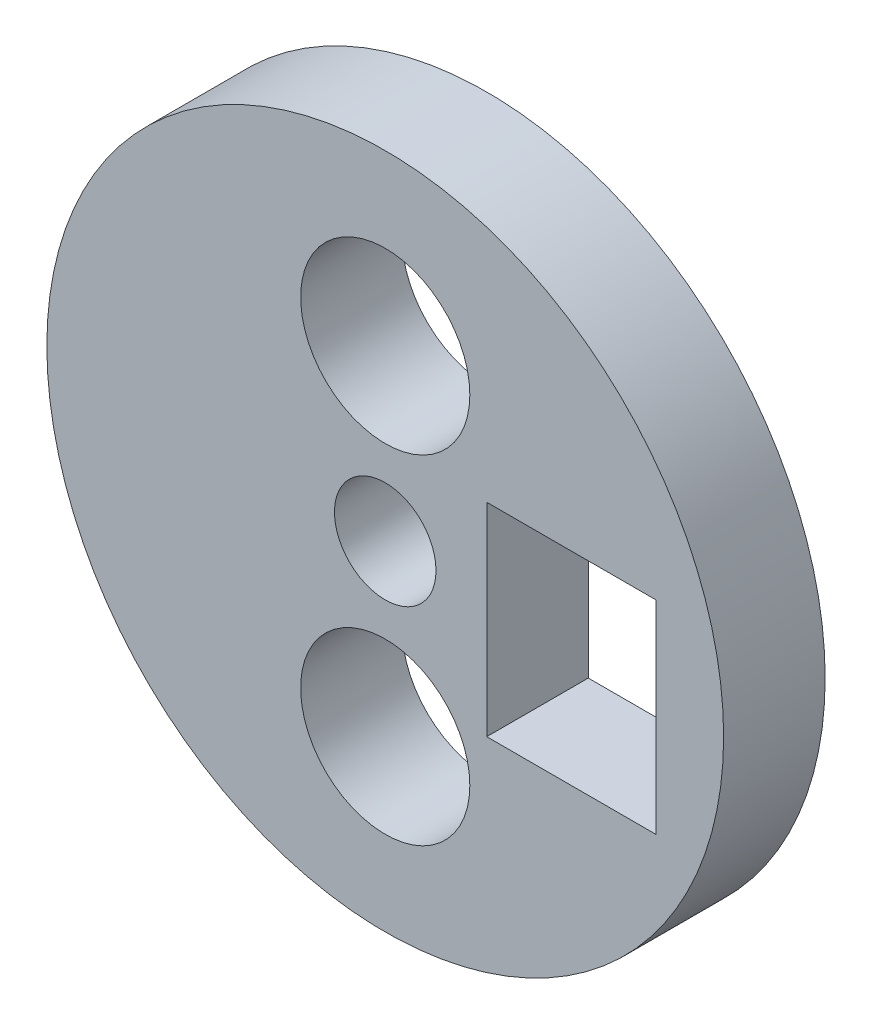
ISO-10303-21;
HEADER;
FILE_DESCRIPTION(('STEP AP214'),'2;1');
FILE_NAME('part.step','',(''),(''),'','','');
FILE_SCHEMA(('AUTOMOTIVE_DESIGN { 1 0 10303 214 1 1 1 1 }'));
ENDSEC;
DATA;
#1=APPLICATION_CONTEXT('core data for automotive mechanical design processes');
#2=APPLICATION_PROTOCOL_DEFINITION('international standard','automotive_design',2000,#1);
#3=PRODUCT_CONTEXT('',#1,'mechanical');
#4=PRODUCT('Part','Part','',(#3));
#5=PRODUCT_RELATED_PRODUCT_CATEGORY('part','',(#4));
#6=PRODUCT_DEFINITION_FORMATION('','',#4);
#7=PRODUCT_DEFINITION_CONTEXT('part definition',#1,'design');
#8=PRODUCT_DEFINITION('design','',#6,#7);
#9=PRODUCT_DEFINITION_SHAPE('','',#8);
#10=(LENGTH_UNIT() NAMED_UNIT(*) SI_UNIT(.MILLI.,.METRE.));
#11=(NAMED_UNIT(*) PLANE_ANGLE_UNIT() SI_UNIT($,.RADIAN.));
#12=(NAMED_UNIT(*) SI_UNIT($,.STERADIAN.) SOLID_ANGLE_UNIT());
#13=UNCERTAINTY_MEASURE_WITH_UNIT(LENGTH_MEASURE(1.E-05),#10,'distance_accuracy_value','');
#14=(GEOMETRIC_REPRESENTATION_CONTEXT(3) GLOBAL_UNCERTAINTY_ASSIGNED_CONTEXT((#13)) GLOBAL_UNIT_ASSIGNED_CONTEXT((#10,
#11,#12)) REPRESENTATION_CONTEXT('',''));
#15=CARTESIAN_POINT('',(0.,0.,0.));
#16=DIRECTION('',(0.,0.,1.));
#17=DIRECTION('',(1.,0.,0.));
#18=AXIS2_PLACEMENT_3D('',#15,#16,#17);
#19=CARTESIAN_POINT('',(0.,0.,3.));
#20=DIRECTION('',(0.,0.,1.));
#21=DIRECTION('',(1.,0.,0.));
#22=AXIS2_PLACEMENT_3D('',#19,#20,#21);
#23=PLANE('',#22);
#24=DIRECTION('',(0.,-1.,0.));
#25=VECTOR('',#24,1.);
#26=CARTESIAN_POINT('',(3.,2.5,3.));
#27=LINE('',#26,#25);
#28=CARTESIAN_POINT('',(3.,2.5,3.));
#29=VERTEX_POINT('',#28);
#30=CARTESIAN_POINT('',(3.,-3.5,3.));
#31=VERTEX_POINT('',#30);
#32=EDGE_CURVE('E48',#29,#31,#27,.T.);
#33=ORIENTED_EDGE('',*,*,#32,.F.);
#34=DIRECTION('',(-1.,0.,0.));
#35=VECTOR('',#34,1.);
#36=CARTESIAN_POINT('',(3.,2.5,3.));
#37=LINE('',#36,#35);
#38=CARTESIAN_POINT('',(8.,2.5,3.));
#39=VERTEX_POINT('',#38);
#40=EDGE_CURVE('E92',#39,#29,#37,.T.);
#41=ORIENTED_EDGE('',*,*,#40,.F.);
#42=DIRECTION('',(0.,1.,0.));
#43=VECTOR('',#42,1.);
#44=CARTESIAN_POINT('',(8.,2.5,3.));
#45=LINE('',#44,#43);
#46=CARTESIAN_POINT('',(8.,-3.5,3.));
#47=VERTEX_POINT('',#46);
#48=EDGE_CURVE('E95',#47,#39,#45,.T.);
#49=ORIENTED_EDGE('',*,*,#48,.F.);
#50=DIRECTION('',(1.,0.,0.));
#51=VECTOR('',#50,1.);
#52=CARTESIAN_POINT('',(3.,-3.5,3.));
#53=LINE('',#52,#51);
#54=EDGE_CURVE('E101',#31,#47,#53,.T.);
#55=ORIENTED_EDGE('',*,*,#54,.F.);
#56=EDGE_LOOP('',(#33,#41,#49,#55));
#57=FACE_BOUND('',#56,.T.);
#58=CARTESIAN_POINT('',(0.,0.,3.));
#59=DIRECTION('',(0.,0.,1.));
#60=DIRECTION('',(1.,0.,0.));
#61=AXIS2_PLACEMENT_3D('',#58,#59,#60);
#62=CIRCLE('',#61,1.5);
#63=CARTESIAN_POINT('',(1.5,0.,3.));
#64=VERTEX_POINT('',#63);
#65=EDGE_CURVE('E117',#64,#64,#62,.T.);
#66=ORIENTED_EDGE('',*,*,#65,.F.);
#67=EDGE_LOOP('',(#66));
#68=FACE_BOUND('',#67,.T.);
#69=CARTESIAN_POINT('',(0.,0.,3.));
#70=DIRECTION('',(0.,0.,1.));
#71=DIRECTION('',(1.,0.,0.));
#72=AXIS2_PLACEMENT_3D('',#69,#70,#71);
#73=CIRCLE('',#72,10.);
#74=CARTESIAN_POINT('',(10.,0.,3.));
#75=VERTEX_POINT('',#74);
#76=EDGE_CURVE('E11',#75,#75,#73,.T.);
#77=ORIENTED_EDGE('',*,*,#76,.T.);
#78=EDGE_LOOP('',(#77));
#79=FACE_BOUND('',#78,.T.);
#80=CARTESIAN_POINT('',(0.,5.,3.));
#81=DIRECTION('',(0.,0.,1.));
#82=DIRECTION('',(1.,0.,0.));
#83=AXIS2_PLACEMENT_3D('',#80,#81,#82);
#84=CIRCLE('',#83,2.5);
#85=CARTESIAN_POINT('',(2.5,5.,3.));
#86=VERTEX_POINT('',#85);
#87=EDGE_CURVE('E123',#86,#86,#84,.T.);
#88=ORIENTED_EDGE('',*,*,#87,.F.);
#89=EDGE_LOOP('',(#88));
#90=FACE_BOUND('',#89,.T.);
#91=CARTESIAN_POINT('',(0.,-5.,3.));
#92=DIRECTION('',(0.,0.,1.));
#93=DIRECTION('',(1.,0.,0.));
#94=AXIS2_PLACEMENT_3D('',#91,#92,#93);
#95=CIRCLE('',#94,2.5);
#96=CARTESIAN_POINT('',(2.5,-5.,3.));
#97=VERTEX_POINT('',#96);
#98=EDGE_CURVE('E111',#97,#97,#95,.T.);
#99=ORIENTED_EDGE('',*,*,#98,.F.);
#100=EDGE_LOOP('',(#99));
#101=FACE_BOUND('',#100,.T.);
#102=ADVANCED_FACE('F33',(#57,#68,#79,#90,#101),#23,.T.);
#103=CARTESIAN_POINT('',(0.,0.,0.));
#104=DIRECTION('',(0.,0.,1.));
#105=DIRECTION('',(1.,0.,0.));
#106=AXIS2_PLACEMENT_3D('',#103,#104,#105);
#107=PLANE('',#106);
#108=DIRECTION('',(-1.,0.,0.));
#109=VECTOR('',#108,1.);
#110=CARTESIAN_POINT('',(3.,2.5,0.));
#111=LINE('',#110,#109);
#112=CARTESIAN_POINT('',(8.,2.5,0.));
#113=VERTEX_POINT('',#112);
#114=CARTESIAN_POINT('',(3.,2.5,0.));
#115=VERTEX_POINT('',#114);
#116=EDGE_CURVE('E82',#113,#115,#111,.T.);
#117=ORIENTED_EDGE('',*,*,#116,.T.);
#118=DIRECTION('',(0.,-1.,0.));
#119=VECTOR('',#118,1.);
#120=CARTESIAN_POINT('',(3.,2.5,0.));
#121=LINE('',#120,#119);
#122=CARTESIAN_POINT('',(3.,-3.5,0.));
#123=VERTEX_POINT('',#122);
#124=EDGE_CURVE('E76',#115,#123,#121,.T.);
#125=ORIENTED_EDGE('',*,*,#124,.T.);
#126=DIRECTION('',(1.,0.,0.));
#127=VECTOR('',#126,1.);
#128=CARTESIAN_POINT('',(3.,-3.5,0.));
#129=LINE('',#128,#127);
#130=CARTESIAN_POINT('',(8.,-3.5,0.));
#131=VERTEX_POINT('',#130);
#132=EDGE_CURVE('E85',#123,#131,#129,.T.);
#133=ORIENTED_EDGE('',*,*,#132,.T.);
#134=DIRECTION('',(0.,1.,0.));
#135=VECTOR('',#134,1.);
#136=CARTESIAN_POINT('',(8.,2.5,0.));
#137=LINE('',#136,#135);
#138=EDGE_CURVE('E56',#131,#113,#137,.T.);
#139=ORIENTED_EDGE('',*,*,#138,.T.);
#140=EDGE_LOOP('',(#117,#125,#133,#139));
#141=FACE_BOUND('',#140,.T.);
#142=CARTESIAN_POINT('',(0.,0.,0.));
#143=DIRECTION('',(0.,0.,1.));
#144=DIRECTION('',(1.,0.,0.));
#145=AXIS2_PLACEMENT_3D('',#142,#143,#144);
#146=CIRCLE('',#145,10.);
#147=CARTESIAN_POINT('',(10.,0.,0.));
#148=VERTEX_POINT('',#147);
#149=EDGE_CURVE('E37',#148,#148,#146,.T.);
#150=ORIENTED_EDGE('',*,*,#149,.F.);
#151=EDGE_LOOP('',(#150));
#152=FACE_BOUND('',#151,.T.);
#153=CARTESIAN_POINT('',(0.,5.,0.));
#154=DIRECTION('',(0.,0.,1.));
#155=DIRECTION('',(1.,0.,0.));
#156=AXIS2_PLACEMENT_3D('',#153,#154,#155);
#157=CIRCLE('',#156,2.5);
#158=CARTESIAN_POINT('',(2.5,5.,0.));
#159=VERTEX_POINT('',#158);
#160=EDGE_CURVE('E120',#159,#159,#157,.T.);
#161=ORIENTED_EDGE('',*,*,#160,.T.);
#162=EDGE_LOOP('',(#161));
#163=FACE_BOUND('',#162,.T.);
#164=CARTESIAN_POINT('',(0.,0.,0.));
#165=DIRECTION('',(0.,0.,1.));
#166=DIRECTION('',(1.,0.,0.));
#167=AXIS2_PLACEMENT_3D('',#164,#165,#166);
#168=CIRCLE('',#167,1.5);
#169=CARTESIAN_POINT('',(1.5,0.,0.));
#170=VERTEX_POINT('',#169);
#171=EDGE_CURVE('E114',#170,#170,#168,.T.);
#172=ORIENTED_EDGE('',*,*,#171,.T.);
#173=EDGE_LOOP('',(#172));
#174=FACE_BOUND('',#173,.T.);
#175=CARTESIAN_POINT('',(0.,-5.,0.));
#176=DIRECTION('',(0.,0.,1.));
#177=DIRECTION('',(1.,0.,0.));
#178=AXIS2_PLACEMENT_3D('',#175,#176,#177);
#179=CIRCLE('',#178,2.5);
#180=CARTESIAN_POINT('',(2.5,-5.,0.));
#181=VERTEX_POINT('',#180);
#182=EDGE_CURVE('E107',#181,#181,#179,.T.);
#183=ORIENTED_EDGE('',*,*,#182,.T.);
#184=EDGE_LOOP('',(#183));
#185=FACE_BOUND('',#184,.T.);
#186=ADVANCED_FACE('F89',(#141,#152,#163,#174,#185),#107,.F.);
#187=CARTESIAN_POINT('',(0.,0.,3.));
#188=DIRECTION('',(0.,0.,-1.));
#189=DIRECTION('',(-1.,0.,0.));
#190=AXIS2_PLACEMENT_3D('',#187,#188,#189);
#191=CYLINDRICAL_SURFACE('',#190,10.);
#192=ORIENTED_EDGE('',*,*,#76,.F.);
#193=EDGE_LOOP('',(#192));
#194=FACE_BOUND('',#193,.T.);
#195=ORIENTED_EDGE('',*,*,#149,.T.);
#196=EDGE_LOOP('',(#195));
#197=FACE_BOUND('',#196,.T.);
#198=ADVANCED_FACE('F35',(#194,#197),#191,.T.);
#199=CARTESIAN_POINT('',(0.,5.,3.));
#200=DIRECTION('',(0.,0.,-1.));
#201=DIRECTION('',(-1.,0.,0.));
#202=AXIS2_PLACEMENT_3D('',#199,#200,#201);
#203=CYLINDRICAL_SURFACE('',#202,2.5);
#204=ORIENTED_EDGE('',*,*,#87,.T.);
#205=EDGE_LOOP('',(#204));
#206=FACE_BOUND('',#205,.T.);
#207=ORIENTED_EDGE('',*,*,#160,.F.);
#208=EDGE_LOOP('',(#207));
#209=FACE_BOUND('',#208,.T.);
#210=ADVANCED_FACE('F131',(#206,#209),#203,.F.);
#211=CARTESIAN_POINT('',(0.,0.,3.));
#212=DIRECTION('',(0.,0.,-1.));
#213=DIRECTION('',(-1.,0.,0.));
#214=AXIS2_PLACEMENT_3D('',#211,#212,#213);
#215=CYLINDRICAL_SURFACE('',#214,1.5);
#216=ORIENTED_EDGE('',*,*,#65,.T.);
#217=EDGE_LOOP('',(#216));
#218=FACE_BOUND('',#217,.T.);
#219=ORIENTED_EDGE('',*,*,#171,.F.);
#220=EDGE_LOOP('',(#219));
#221=FACE_BOUND('',#220,.T.);
#222=ADVANCED_FACE('F133',(#218,#221),#215,.F.);
#223=CARTESIAN_POINT('',(0.,-5.,3.));
#224=DIRECTION('',(0.,0.,-1.));
#225=DIRECTION('',(-1.,0.,0.));
#226=AXIS2_PLACEMENT_3D('',#223,#224,#225);
#227=CYLINDRICAL_SURFACE('',#226,2.5);
#228=ORIENTED_EDGE('',*,*,#98,.T.);
#229=EDGE_LOOP('',(#228));
#230=FACE_BOUND('',#229,.T.);
#231=ORIENTED_EDGE('',*,*,#182,.F.);
#232=EDGE_LOOP('',(#231));
#233=FACE_BOUND('',#232,.T.);
#234=ADVANCED_FACE('F140',(#230,#233),#227,.F.);
#235=CARTESIAN_POINT('',(3.,2.5,0.));
#236=DIRECTION('',(-1.,0.,0.));
#237=DIRECTION('',(0.,-1.,0.));
#238=AXIS2_PLACEMENT_3D('',#235,#236,#237);
#239=PLANE('',#238);
#240=ORIENTED_EDGE('',*,*,#32,.T.);
#241=DIRECTION('',(0.,0.,1.));
#242=VECTOR('',#241,1.);
#243=CARTESIAN_POINT('',(3.,-3.5,0.));
#244=LINE('',#243,#242);
#245=EDGE_CURVE('E72',#123,#31,#244,.T.);
#246=ORIENTED_EDGE('',*,*,#245,.F.);
#247=ORIENTED_EDGE('',*,*,#124,.F.);
#248=DIRECTION('',(0.,0.,1.));
#249=VECTOR('',#248,1.);
#250=CARTESIAN_POINT('',(3.,2.5,0.));
#251=LINE('',#250,#249);
#252=EDGE_CURVE('E105',#115,#29,#251,.T.);
#253=ORIENTED_EDGE('',*,*,#252,.T.);
#254=EDGE_LOOP('',(#240,#246,#247,#253));
#255=FACE_BOUND('',#254,.T.);
#256=ADVANCED_FACE('F74',(#255),#239,.F.);
#257=CARTESIAN_POINT('',(3.,2.5,0.));
#258=DIRECTION('',(0.,1.,0.));
#259=DIRECTION('',(0.,0.,1.));
#260=AXIS2_PLACEMENT_3D('',#257,#258,#259);
#261=PLANE('',#260);
#262=ORIENTED_EDGE('',*,*,#40,.T.);
#263=ORIENTED_EDGE('',*,*,#252,.F.);
#264=ORIENTED_EDGE('',*,*,#116,.F.);
#265=DIRECTION('',(0.,0.,1.));
#266=VECTOR('',#265,1.);
#267=CARTESIAN_POINT('',(8.,2.5,0.));
#268=LINE('',#267,#266);
#269=EDGE_CURVE('E108',#113,#39,#268,.T.);
#270=ORIENTED_EDGE('',*,*,#269,.T.);
#271=EDGE_LOOP('',(#262,#263,#264,#270));
#272=FACE_BOUND('',#271,.T.);
#273=ADVANCED_FACE('F168',(#272),#261,.F.);
#274=CARTESIAN_POINT('',(8.,2.5,0.));
#275=DIRECTION('',(1.,0.,0.));
#276=DIRECTION('',(0.,0.,-1.));
#277=AXIS2_PLACEMENT_3D('',#274,#275,#276);
#278=PLANE('',#277);
#279=ORIENTED_EDGE('',*,*,#48,.T.);
#280=ORIENTED_EDGE('',*,*,#269,.F.);
#281=ORIENTED_EDGE('',*,*,#138,.F.);
#282=DIRECTION('',(0.,0.,1.));
#283=VECTOR('',#282,1.);
#284=CARTESIAN_POINT('',(8.,-3.5,0.));
#285=LINE('',#284,#283);
#286=EDGE_CURVE('E81',#131,#47,#285,.T.);
#287=ORIENTED_EDGE('',*,*,#286,.T.);
#288=EDGE_LOOP('',(#279,#280,#281,#287));
#289=FACE_BOUND('',#288,.T.);
#290=ADVANCED_FACE('F173',(#289),#278,.F.);
#291=CARTESIAN_POINT('',(3.,-3.5,0.));
#292=DIRECTION('',(0.,-1.,0.));
#293=DIRECTION('',(0.,0.,-1.));
#294=AXIS2_PLACEMENT_3D('',#291,#292,#293);
#295=PLANE('',#294);
#296=ORIENTED_EDGE('',*,*,#54,.T.);
#297=ORIENTED_EDGE('',*,*,#286,.F.);
#298=ORIENTED_EDGE('',*,*,#132,.F.);
#299=ORIENTED_EDGE('',*,*,#245,.T.);
#300=EDGE_LOOP('',(#296,#297,#298,#299));
#301=FACE_BOUND('',#300,.T.);
#302=ADVANCED_FACE('F86',(#301),#295,.F.);
#303=CLOSED_SHELL('',(#102,#186,#198,#210,#222,#234,#256,#273,#290,#302));
#304=MANIFOLD_SOLID_BREP('B2',#303);
#305=ADVANCED_BREP_SHAPE_REPRESENTATION('',(#18,#304),#14);
#306=SHAPE_DEFINITION_REPRESENTATION(#9,#305);
ENDSEC;
END-ISO-10303-21;
